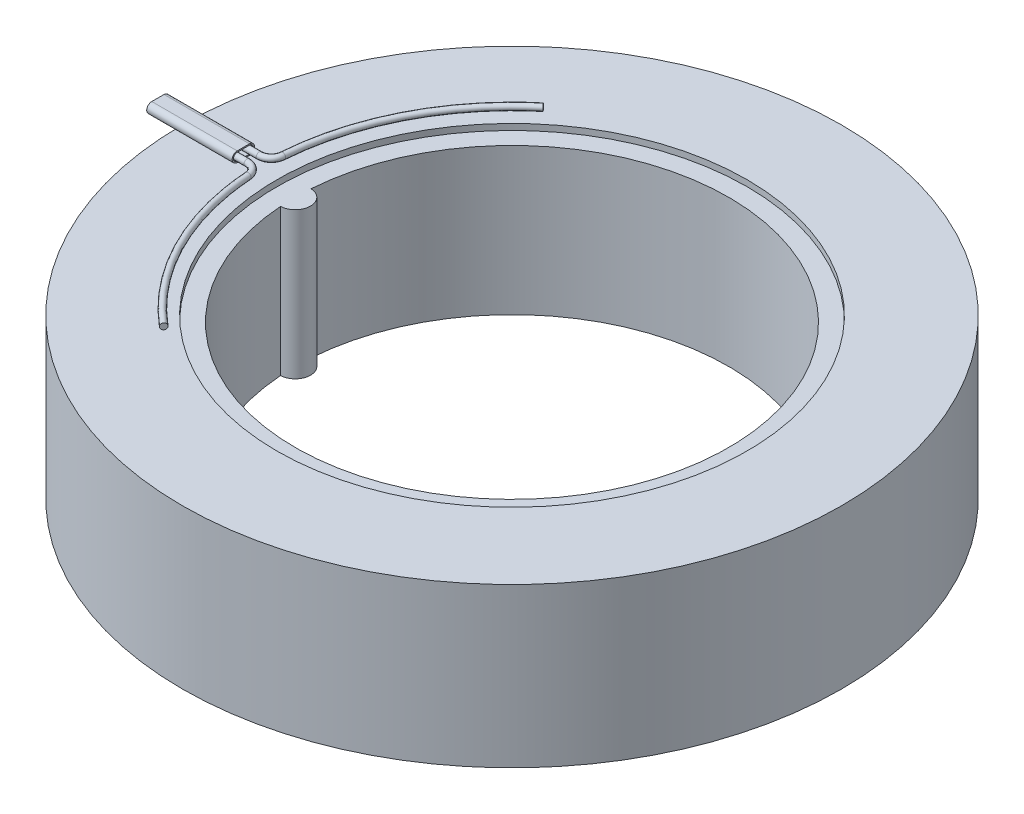
ISO-10303-21;
HEADER;
FILE_DESCRIPTION(('STEP AP214'),'2;1');
FILE_NAME('part.step','',(''),(''),'','','');
FILE_SCHEMA(('AUTOMOTIVE_DESIGN { 1 0 10303 214 1 1 1 1 }'));
ENDSEC;
DATA;
#1=APPLICATION_CONTEXT('core data for automotive mechanical design processes');
#2=APPLICATION_PROTOCOL_DEFINITION('international standard','automotive_design',2000,#1);
#3=PRODUCT_CONTEXT('',#1,'mechanical');
#4=PRODUCT('Part','Part','',(#3));
#5=PRODUCT_RELATED_PRODUCT_CATEGORY('part','',(#4));
#6=PRODUCT_DEFINITION_FORMATION('','',#4);
#7=PRODUCT_DEFINITION_CONTEXT('part definition',#1,'design');
#8=PRODUCT_DEFINITION('design','',#6,#7);
#9=PRODUCT_DEFINITION_SHAPE('','',#8);
#10=(LENGTH_UNIT() NAMED_UNIT(*) SI_UNIT(.MILLI.,.METRE.));
#11=(NAMED_UNIT(*) PLANE_ANGLE_UNIT() SI_UNIT($,.RADIAN.));
#12=(NAMED_UNIT(*) SI_UNIT($,.STERADIAN.) SOLID_ANGLE_UNIT());
#13=UNCERTAINTY_MEASURE_WITH_UNIT(LENGTH_MEASURE(1.E-05),#10,'distance_accuracy_value','');
#14=(GEOMETRIC_REPRESENTATION_CONTEXT(3) GLOBAL_UNCERTAINTY_ASSIGNED_CONTEXT((#13)) GLOBAL_UNIT_ASSIGNED_CONTEXT((#10,
#11,#12)) REPRESENTATION_CONTEXT('',''));
#15=CARTESIAN_POINT('',(0.,0.,0.));
#16=DIRECTION('',(0.,0.,1.));
#17=DIRECTION('',(1.,0.,0.));
#18=AXIS2_PLACEMENT_3D('',#15,#16,#17);
#19=CARTESIAN_POINT('',(-17.75,9.53553390593274,0.));
#20=DIRECTION('',(0.,-1.,0.));
#21=DIRECTION('',(0.,0.,-1.));
#22=AXIS2_PLACEMENT_3D('',#19,#20,#21);
#23=CYLINDRICAL_SURFACE('',#22,1.25);
#24=DIRECTION('',(0.,1.,0.));
#25=VECTOR('',#24,1.);
#26=CARTESIAN_POINT('',(-17.705985915493,0.,-1.24922486381157));
#27=LINE('',#26,#25);
#28=CARTESIAN_POINT('',(-17.705985915493,-6.,-1.24922486381156));
#29=VERTEX_POINT('',#28);
#30=CARTESIAN_POINT('',(-17.705985915493,6.,-1.24922486381156));
#31=VERTEX_POINT('',#30);
#32=EDGE_CURVE('P0_E39',#29,#31,#27,.T.);
#33=ORIENTED_EDGE('',*,*,#32,.T.);
#34=CARTESIAN_POINT('',(-17.75,6.,0.));
#35=DIRECTION('',(0.,-1.,0.));
#36=DIRECTION('',(0.,0.,-1.));
#37=AXIS2_PLACEMENT_3D('',#34,#35,#36);
#38=CIRCLE('',#37,1.25);
#39=CARTESIAN_POINT('',(-17.705985915493,6.,1.24922486381156));
#40=VERTEX_POINT('',#39);
#41=EDGE_CURVE('P0_E51',#40,#31,#38,.F.);
#42=ORIENTED_EDGE('',*,*,#41,.F.);
#43=DIRECTION('',(0.,-1.,0.));
#44=VECTOR('',#43,1.);
#45=CARTESIAN_POINT('',(-17.705985915493,9.53553390593274,1.24922486381156));
#46=LINE('',#45,#44);
#47=CARTESIAN_POINT('',(-17.705985915493,-6.,1.24922486381156));
#48=VERTEX_POINT('',#47);
#49=EDGE_CURVE('P0_E44',#40,#48,#46,.T.);
#50=ORIENTED_EDGE('',*,*,#49,.T.);
#51=CARTESIAN_POINT('',(-17.75,-6.,0.));
#52=DIRECTION('',(0.,-1.,0.));
#53=DIRECTION('',(0.,0.,-1.));
#54=AXIS2_PLACEMENT_3D('',#51,#52,#53);
#55=CIRCLE('',#54,1.25);
#56=EDGE_CURVE('P0_E48',#29,#48,#55,.T.);
#57=ORIENTED_EDGE('',*,*,#56,.F.);
#58=EDGE_LOOP('',(#33,#42,#50,#57));
#59=FACE_BOUND('',#58,.T.);
#60=ADVANCED_FACE('P0_F16',(#59),#23,.T.);
#61=CARTESIAN_POINT('',(0.,0.,0.));
#62=DIRECTION('',(0.,1.,0.));
#63=DIRECTION('',(0.,0.,1.));
#64=AXIS2_PLACEMENT_3D('',#61,#62,#63);
#65=CYLINDRICAL_SURFACE('',#64,17.75);
#66=CARTESIAN_POINT('',(0.,-6.,0.));
#67=DIRECTION('',(0.,1.,0.));
#68=DIRECTION('',(0.,0.,1.));
#69=AXIS2_PLACEMENT_3D('',#66,#67,#68);
#70=CIRCLE('',#69,17.75);
#71=EDGE_CURVE('P0_E19',#48,#29,#70,.T.);
#72=ORIENTED_EDGE('',*,*,#71,.F.);
#73=ORIENTED_EDGE('',*,*,#49,.F.);
#74=CARTESIAN_POINT('',(0.,6.,0.));
#75=DIRECTION('',(0.,1.,0.));
#76=DIRECTION('',(0.,0.,1.));
#77=AXIS2_PLACEMENT_3D('',#74,#75,#76);
#78=CIRCLE('',#77,17.75);
#79=EDGE_CURVE('P0_E34',#31,#40,#78,.F.);
#80=ORIENTED_EDGE('',*,*,#79,.F.);
#81=ORIENTED_EDGE('',*,*,#32,.F.);
#82=EDGE_LOOP('',(#72,#73,#80,#81));
#83=FACE_BOUND('',#82,.T.);
#84=ADVANCED_FACE('P0_F43',(#83),#65,.F.);
#85=CARTESIAN_POINT('',(-19.25,-6.,0.));
#86=DIRECTION('',(0.,-1.,0.));
#87=DIRECTION('',(0.,0.,-1.));
#88=AXIS2_PLACEMENT_3D('',#85,#86,#87);
#89=PLANE('',#88);
#90=CARTESIAN_POINT('',(0.,-6.,0.));
#91=DIRECTION('',(0.,1.,0.));
#92=DIRECTION('',(0.,0.,1.));
#93=AXIS2_PLACEMENT_3D('',#90,#91,#92);
#94=CIRCLE('',#93,19.25);
#95=CARTESIAN_POINT('',(0.,-6.,19.25));
#96=VERTEX_POINT('',#95);
#97=EDGE_CURVE('P0_E25',#96,#96,#94,.T.);
#98=ORIENTED_EDGE('',*,*,#97,.F.);
#99=EDGE_LOOP('',(#98));
#100=FACE_BOUND('',#99,.T.);
#101=ORIENTED_EDGE('',*,*,#71,.T.);
#102=ORIENTED_EDGE('',*,*,#56,.T.);
#103=EDGE_LOOP('',(#101,#102));
#104=FACE_BOUND('',#103,.T.);
#105=ADVANCED_FACE('P0_F53',(#100,#104),#89,.T.);
#106=CARTESIAN_POINT('',(-17.75,6.,0.));
#107=DIRECTION('',(0.,1.,0.));
#108=DIRECTION('',(0.,0.,1.));
#109=AXIS2_PLACEMENT_3D('',#106,#107,#108);
#110=PLANE('',#109);
#111=ORIENTED_EDGE('',*,*,#41,.T.);
#112=ORIENTED_EDGE('',*,*,#79,.T.);
#113=EDGE_LOOP('',(#111,#112));
#114=FACE_BOUND('',#113,.T.);
#115=CARTESIAN_POINT('',(0.,6.,0.));
#116=DIRECTION('',(0.,1.,0.));
#117=DIRECTION('',(0.,0.,1.));
#118=AXIS2_PLACEMENT_3D('',#115,#116,#117);
#119=CIRCLE('',#118,19.25);
#120=CARTESIAN_POINT('',(0.,6.,19.25));
#121=VERTEX_POINT('',#120);
#122=EDGE_CURVE('P0_E11',#121,#121,#119,.F.);
#123=ORIENTED_EDGE('',*,*,#122,.F.);
#124=EDGE_LOOP('',(#123));
#125=FACE_BOUND('',#124,.T.);
#126=ADVANCED_FACE('P0_F60',(#114,#125),#110,.T.);
#127=CARTESIAN_POINT('',(0.,0.,0.));
#128=DIRECTION('',(0.,1.,0.));
#129=DIRECTION('',(0.,0.,1.));
#130=AXIS2_PLACEMENT_3D('',#127,#128,#129);
#131=CYLINDRICAL_SURFACE('',#130,19.25);
#132=ORIENTED_EDGE('',*,*,#122,.T.);
#133=EDGE_LOOP('',(#132));
#134=FACE_BOUND('',#133,.T.);
#135=ORIENTED_EDGE('',*,*,#97,.T.);
#136=EDGE_LOOP('',(#135));
#137=FACE_BOUND('',#136,.T.);
#138=ADVANCED_FACE('P0_F63',(#134,#137),#131,.T.);
#139=CLOSED_SHELL('',(#60,#84,#105,#126,#138));
#140=MANIFOLD_SOLID_BREP('P0_B1',#139);
#141=CARTESIAN_POINT('',(-29.,7.31488072437514,-0.499999999999997));
#142=DIRECTION('',(0.,1.,0.));
#143=DIRECTION('',(0.,0.,1.));
#144=AXIS2_PLACEMENT_3D('',#141,#142,#143);
#145=PLANE('',#144);
#146=DIRECTION('',(1.,0.,0.));
#147=VECTOR('',#146,1.);
#148=CARTESIAN_POINT('',(-29.,7.31488072437514,0.499999999999997));
#149=LINE('',#148,#147);
#150=CARTESIAN_POINT('',(-22.,7.31488072437514,0.499999999999997));
#151=VERTEX_POINT('',#150);
#152=CARTESIAN_POINT('',(-29.,7.31488072437514,0.499999999999997));
#153=VERTEX_POINT('',#152);
#154=EDGE_CURVE('P1_E91',#151,#153,#149,.F.);
#155=ORIENTED_EDGE('',*,*,#154,.T.);
#156=DIRECTION('',(0.,0.,1.));
#157=VECTOR('',#156,1.);
#158=CARTESIAN_POINT('',(-29.,7.31488072437514,-0.499999999999997));
#159=LINE('',#158,#157);
#160=CARTESIAN_POINT('',(-29.,7.31488072437514,-0.499999999999997));
#161=VERTEX_POINT('',#160);
#162=EDGE_CURVE('P1_E78',#161,#153,#159,.T.);
#163=ORIENTED_EDGE('',*,*,#162,.F.);
#164=DIRECTION('',(1.,0.,0.));
#165=VECTOR('',#164,1.);
#166=CARTESIAN_POINT('',(-29.,7.31488072437514,-0.499999999999997));
#167=LINE('',#166,#165);
#168=CARTESIAN_POINT('',(-22.,7.31488072437514,-0.499999999999997));
#169=VERTEX_POINT('',#168);
#170=EDGE_CURVE('P1_E100',#161,#169,#167,.T.);
#171=ORIENTED_EDGE('',*,*,#170,.T.);
#172=DIRECTION('',(0.,0.,1.));
#173=VECTOR('',#172,1.);
#174=CARTESIAN_POINT('',(-22.,7.31488072437514,-0.499999999999997));
#175=LINE('',#174,#173);
#176=EDGE_CURVE('P1_E88',#151,#169,#175,.F.);
#177=ORIENTED_EDGE('',*,*,#176,.F.);
#178=EDGE_LOOP('',(#155,#163,#171,#177));
#179=FACE_BOUND('',#178,.T.);
#180=ADVANCED_FACE('P1_F16',(#179),#145,.F.);
#181=CARTESIAN_POINT('',(-29.,7.,0.499999999999997));
#182=DIRECTION('',(1.,0.,0.));
#183=DIRECTION('',(0.,0.,-1.));
#184=AXIS2_PLACEMENT_3D('',#181,#182,#183);
#185=CYLINDRICAL_SURFACE('',#184,0.31488072437514);
#186=DIRECTION('',(1.,0.,0.));
#187=VECTOR('',#186,1.);
#188=CARTESIAN_POINT('',(-29.,6.68511927562486,0.499999999999997));
#189=LINE('',#188,#187);
#190=CARTESIAN_POINT('',(-22.,6.68511927562486,0.499999999999997));
#191=VERTEX_POINT('',#190);
#192=CARTESIAN_POINT('',(-29.,6.68511927562486,0.499999999999997));
#193=VERTEX_POINT('',#192);
#194=EDGE_CURVE('P1_E97',#191,#193,#189,.F.);
#195=ORIENTED_EDGE('',*,*,#194,.T.);
#196=CARTESIAN_POINT('',(-29.,7.,0.499999999999997));
#197=DIRECTION('',(1.,0.,0.));
#198=DIRECTION('',(0.,0.,-1.));
#199=AXIS2_PLACEMENT_3D('',#196,#197,#198);
#200=CIRCLE('',#199,0.31488072437514);
#201=EDGE_CURVE('P1_E19',#153,#193,#200,.T.);
#202=ORIENTED_EDGE('',*,*,#201,.F.);
#203=ORIENTED_EDGE('',*,*,#154,.F.);
#204=CARTESIAN_POINT('',(-22.,7.,0.499999999999997));
#205=DIRECTION('',(1.,0.,0.));
#206=DIRECTION('',(0.,0.,-1.));
#207=AXIS2_PLACEMENT_3D('',#204,#205,#206);
#208=CIRCLE('',#207,0.31488072437514);
#209=EDGE_CURVE('P1_E99',#191,#151,#208,.F.);
#210=ORIENTED_EDGE('',*,*,#209,.F.);
#211=EDGE_LOOP('',(#195,#202,#203,#210));
#212=FACE_BOUND('',#211,.T.);
#213=ADVANCED_FACE('P1_F95',(#212),#185,.F.);
#214=CARTESIAN_POINT('',(-29.,7.,-0.499999999999997));
#215=DIRECTION('',(1.,0.,0.));
#216=DIRECTION('',(0.,0.,-1.));
#217=AXIS2_PLACEMENT_3D('',#214,#215,#216);
#218=CYLINDRICAL_SURFACE('',#217,0.314880724375139);
#219=CARTESIAN_POINT('',(-29.,7.,-0.499999999999997));
#220=DIRECTION('',(1.,0.,0.));
#221=DIRECTION('',(0.,0.,-1.));
#222=AXIS2_PLACEMENT_3D('',#219,#220,#221);
#223=CIRCLE('',#222,0.314880724375139);
#224=CARTESIAN_POINT('',(-29.,6.68511927562486,-0.499999999999997));
#225=VERTEX_POINT('',#224);
#226=EDGE_CURVE('P1_E84',#225,#161,#223,.T.);
#227=ORIENTED_EDGE('',*,*,#226,.F.);
#228=DIRECTION('',(1.,0.,0.));
#229=VECTOR('',#228,1.);
#230=CARTESIAN_POINT('',(-29.,6.68511927562486,-0.499999999999997));
#231=LINE('',#230,#229);
#232=CARTESIAN_POINT('',(-22.,6.68511927562486,-0.499999999999997));
#233=VERTEX_POINT('',#232);
#234=EDGE_CURVE('P1_E125',#225,#233,#231,.T.);
#235=ORIENTED_EDGE('',*,*,#234,.T.);
#236=CARTESIAN_POINT('',(-22.,7.,-0.499999999999997));
#237=DIRECTION('',(1.,0.,0.));
#238=DIRECTION('',(0.,0.,-1.));
#239=AXIS2_PLACEMENT_3D('',#236,#237,#238);
#240=CIRCLE('',#239,0.314880724375139);
#241=EDGE_CURVE('P1_E106',#169,#233,#240,.F.);
#242=ORIENTED_EDGE('',*,*,#241,.F.);
#243=ORIENTED_EDGE('',*,*,#170,.F.);
#244=EDGE_LOOP('',(#227,#235,#242,#243));
#245=FACE_BOUND('',#244,.T.);
#246=ADVANCED_FACE('P1_F167',(#245),#218,.F.);
#247=CARTESIAN_POINT('',(-29.,6.68511927562486,-0.499999999999997));
#248=DIRECTION('',(0.,-1.,0.));
#249=DIRECTION('',(0.,0.,-1.));
#250=AXIS2_PLACEMENT_3D('',#247,#248,#249);
#251=PLANE('',#250);
#252=ORIENTED_EDGE('',*,*,#234,.F.);
#253=DIRECTION('',(0.,0.,-1.));
#254=VECTOR('',#253,1.);
#255=CARTESIAN_POINT('',(-29.,6.68511927562486,-0.499999999999997));
#256=LINE('',#255,#254);
#257=EDGE_CURVE('P1_E131',#225,#193,#256,.F.);
#258=ORIENTED_EDGE('',*,*,#257,.T.);
#259=ORIENTED_EDGE('',*,*,#194,.F.);
#260=DIRECTION('',(0.,0.,-1.));
#261=VECTOR('',#260,1.);
#262=CARTESIAN_POINT('',(-22.,6.68511927562486,-0.499999999999997));
#263=LINE('',#262,#261);
#264=EDGE_CURVE('P1_E109',#233,#191,#263,.F.);
#265=ORIENTED_EDGE('',*,*,#264,.F.);
#266=EDGE_LOOP('',(#252,#258,#259,#265));
#267=FACE_BOUND('',#266,.T.);
#268=ADVANCED_FACE('P1_F159',(#267),#251,.F.);
#269=CARTESIAN_POINT('',(-29.,7.,-0.499999999999997));
#270=DIRECTION('',(1.,0.,0.));
#271=DIRECTION('',(0.,0.,-1.));
#272=AXIS2_PLACEMENT_3D('',#269,#270,#271);
#273=CYLINDRICAL_SURFACE('',#272,0.414880724375139);
#274=CARTESIAN_POINT('',(-22.,7.,-0.499999999999997));
#275=DIRECTION('',(1.,0.,0.));
#276=DIRECTION('',(0.,0.,-1.));
#277=AXIS2_PLACEMENT_3D('',#274,#275,#276);
#278=CIRCLE('',#277,0.414880724375139);
#279=CARTESIAN_POINT('',(-22.,6.58511927562486,-0.499999999999997));
#280=VERTEX_POINT('',#279);
#281=CARTESIAN_POINT('',(-22.,7.41488072437514,-0.499999999999997));
#282=VERTEX_POINT('',#281);
#283=EDGE_CURVE('P1_E108',#280,#282,#278,.T.);
#284=ORIENTED_EDGE('',*,*,#283,.F.);
#285=DIRECTION('',(1.,0.,0.));
#286=VECTOR('',#285,1.);
#287=CARTESIAN_POINT('',(-29.,6.58511927562486,-0.499999999999997));
#288=LINE('',#287,#286);
#289=CARTESIAN_POINT('',(-29.,6.58511927562486,-0.499999999999997));
#290=VERTEX_POINT('',#289);
#291=EDGE_CURVE('P1_E120',#290,#280,#288,.T.);
#292=ORIENTED_EDGE('',*,*,#291,.F.);
#293=CARTESIAN_POINT('',(-29.,7.,-0.499999999999997));
#294=DIRECTION('',(1.,0.,0.));
#295=DIRECTION('',(0.,0.,-1.));
#296=AXIS2_PLACEMENT_3D('',#293,#294,#295);
#297=CIRCLE('',#296,0.414880724375139);
#298=CARTESIAN_POINT('',(-29.,7.41488072437514,-0.499999999999997));
#299=VERTEX_POINT('',#298);
#300=EDGE_CURVE('P1_E112',#290,#299,#297,.T.);
#301=ORIENTED_EDGE('',*,*,#300,.T.);
#302=DIRECTION('',(1.,0.,0.));
#303=VECTOR('',#302,1.);
#304=CARTESIAN_POINT('',(-29.,7.41488072437514,-0.499999999999997));
#305=LINE('',#304,#303);
#306=EDGE_CURVE('P1_E128',#282,#299,#305,.F.);
#307=ORIENTED_EDGE('',*,*,#306,.F.);
#308=EDGE_LOOP('',(#284,#292,#301,#307));
#309=FACE_BOUND('',#308,.T.);
#310=ADVANCED_FACE('P1_F157',(#309),#273,.T.);
#311=CARTESIAN_POINT('',(-22.,7.,-0.499999999999997));
#312=DIRECTION('',(1.,0.,0.));
#313=DIRECTION('',(0.,0.,-1.));
#314=AXIS2_PLACEMENT_3D('',#311,#312,#313);
#315=PLANE('',#314);
#316=CARTESIAN_POINT('',(-22.,7.,0.499999999999997));
#317=DIRECTION('',(1.,0.,0.));
#318=DIRECTION('',(0.,0.,-1.));
#319=AXIS2_PLACEMENT_3D('',#316,#317,#318);
#320=CIRCLE('',#319,0.41488072437514);
#321=CARTESIAN_POINT('',(-22.,6.58511927562486,0.499999999999997));
#322=VERTEX_POINT('',#321);
#323=CARTESIAN_POINT('',(-22.,7.41488072437514,0.499999999999997));
#324=VERTEX_POINT('',#323);
#325=EDGE_CURVE('P1_E116',#322,#324,#320,.F.);
#326=ORIENTED_EDGE('',*,*,#325,.F.);
#327=DIRECTION('',(0.,0.,-1.));
#328=VECTOR('',#327,1.);
#329=CARTESIAN_POINT('',(-22.,6.58511927562486,-0.499999999999997));
#330=LINE('',#329,#328);
#331=EDGE_CURVE('P1_E114',#280,#322,#330,.F.);
#332=ORIENTED_EDGE('',*,*,#331,.F.);
#333=ORIENTED_EDGE('',*,*,#283,.T.);
#334=DIRECTION('',(0.,0.,1.));
#335=VECTOR('',#334,1.);
#336=CARTESIAN_POINT('',(-22.,7.41488072437514,-0.499999999999997));
#337=LINE('',#336,#335);
#338=EDGE_CURVE('P1_E111',#324,#282,#337,.F.);
#339=ORIENTED_EDGE('',*,*,#338,.F.);
#340=EDGE_LOOP('',(#326,#332,#333,#339));
#341=FACE_BOUND('',#340,.T.);
#342=ORIENTED_EDGE('',*,*,#176,.T.);
#343=ORIENTED_EDGE('',*,*,#241,.T.);
#344=ORIENTED_EDGE('',*,*,#264,.T.);
#345=ORIENTED_EDGE('',*,*,#209,.T.);
#346=EDGE_LOOP('',(#342,#343,#344,#345));
#347=FACE_BOUND('',#346,.T.);
#348=ADVANCED_FACE('P1_F152',(#341,#347),#315,.T.);
#349=CARTESIAN_POINT('',(-29.,7.41488072437514,-0.499999999999997));
#350=DIRECTION('',(0.,1.,0.));
#351=DIRECTION('',(0.,0.,1.));
#352=AXIS2_PLACEMENT_3D('',#349,#350,#351);
#353=PLANE('',#352);
#354=DIRECTION('',(0.,0.,-1.));
#355=VECTOR('',#354,1.);
#356=CARTESIAN_POINT('',(-29.,7.41488072437514,-0.499999999999997));
#357=LINE('',#356,#355);
#358=CARTESIAN_POINT('',(-29.,7.41488072437514,0.499999999999997));
#359=VERTEX_POINT('',#358);
#360=EDGE_CURVE('P1_E115',#299,#359,#357,.F.);
#361=ORIENTED_EDGE('',*,*,#360,.T.);
#362=DIRECTION('',(1.,0.,0.));
#363=VECTOR('',#362,1.);
#364=CARTESIAN_POINT('',(-29.,7.41488072437514,0.499999999999997));
#365=LINE('',#364,#363);
#366=EDGE_CURVE('P1_E119',#324,#359,#365,.F.);
#367=ORIENTED_EDGE('',*,*,#366,.F.);
#368=ORIENTED_EDGE('',*,*,#338,.T.);
#369=ORIENTED_EDGE('',*,*,#306,.T.);
#370=EDGE_LOOP('',(#361,#367,#368,#369));
#371=FACE_BOUND('',#370,.T.);
#372=ADVANCED_FACE('P1_F146',(#371),#353,.T.);
#373=CARTESIAN_POINT('',(-29.,7.,-0.499999999999997));
#374=DIRECTION('',(1.,0.,0.));
#375=DIRECTION('',(0.,0.,-1.));
#376=AXIS2_PLACEMENT_3D('',#373,#374,#375);
#377=PLANE('',#376);
#378=DIRECTION('',(0.,0.,-1.));
#379=VECTOR('',#378,1.);
#380=CARTESIAN_POINT('',(-29.,6.58511927562486,-0.499999999999997));
#381=LINE('',#380,#379);
#382=CARTESIAN_POINT('',(-29.,6.58511927562486,0.499999999999997));
#383=VERTEX_POINT('',#382);
#384=EDGE_CURVE('P1_E34',#383,#290,#381,.T.);
#385=ORIENTED_EDGE('',*,*,#384,.F.);
#386=CARTESIAN_POINT('',(-29.,7.,0.499999999999997));
#387=DIRECTION('',(1.,0.,0.));
#388=DIRECTION('',(0.,0.,-1.));
#389=AXIS2_PLACEMENT_3D('',#386,#387,#388);
#390=CIRCLE('',#389,0.41488072437514);
#391=EDGE_CURVE('P1_E25',#359,#383,#390,.T.);
#392=ORIENTED_EDGE('',*,*,#391,.F.);
#393=ORIENTED_EDGE('',*,*,#360,.F.);
#394=ORIENTED_EDGE('',*,*,#300,.F.);
#395=EDGE_LOOP('',(#385,#392,#393,#394));
#396=FACE_BOUND('',#395,.T.);
#397=ORIENTED_EDGE('',*,*,#257,.F.);
#398=ORIENTED_EDGE('',*,*,#226,.T.);
#399=ORIENTED_EDGE('',*,*,#162,.T.);
#400=ORIENTED_EDGE('',*,*,#201,.T.);
#401=EDGE_LOOP('',(#397,#398,#399,#400));
#402=FACE_BOUND('',#401,.T.);
#403=ADVANCED_FACE('P1_F81',(#396,#402),#377,.F.);
#404=CARTESIAN_POINT('',(-29.,6.58511927562486,-0.499999999999997));
#405=DIRECTION('',(0.,-1.,0.));
#406=DIRECTION('',(0.,0.,-1.));
#407=AXIS2_PLACEMENT_3D('',#404,#405,#406);
#408=PLANE('',#407);
#409=ORIENTED_EDGE('',*,*,#384,.T.);
#410=ORIENTED_EDGE('',*,*,#291,.T.);
#411=ORIENTED_EDGE('',*,*,#331,.T.);
#412=DIRECTION('',(1.,0.,0.));
#413=VECTOR('',#412,1.);
#414=CARTESIAN_POINT('',(-29.,6.58511927562486,0.499999999999997));
#415=LINE('',#414,#413);
#416=EDGE_CURVE('P1_E11',#383,#322,#415,.T.);
#417=ORIENTED_EDGE('',*,*,#416,.F.);
#418=EDGE_LOOP('',(#409,#410,#411,#417));
#419=FACE_BOUND('',#418,.T.);
#420=ADVANCED_FACE('P1_F154',(#419),#408,.T.);
#421=CARTESIAN_POINT('',(-29.,7.,0.499999999999997));
#422=DIRECTION('',(1.,0.,0.));
#423=DIRECTION('',(0.,0.,-1.));
#424=AXIS2_PLACEMENT_3D('',#421,#422,#423);
#425=CYLINDRICAL_SURFACE('',#424,0.41488072437514);
#426=ORIENTED_EDGE('',*,*,#391,.T.);
#427=ORIENTED_EDGE('',*,*,#416,.T.);
#428=ORIENTED_EDGE('',*,*,#325,.T.);
#429=ORIENTED_EDGE('',*,*,#366,.T.);
#430=EDGE_LOOP('',(#426,#427,#428,#429));
#431=FACE_BOUND('',#430,.T.);
#432=ADVANCED_FACE('P1_F149',(#431),#425,.T.);
#433=CLOSED_SHELL('',(#180,#213,#246,#268,#310,#348,#372,#403,#420,#432));
#434=MANIFOLD_SOLID_BREP('P1_B1',#433);
#435=CARTESIAN_POINT('',(-25.807382336069,7.,0.499999999999997));
#436=DIRECTION('',(-1.,0.,0.));
#437=DIRECTION('',(0.,0.,1.));
#438=AXIS2_PLACEMENT_3D('',#435,#436,#437);
#439=PLANE('',#438);
#440=CARTESIAN_POINT('',(-25.807382336069,7.,0.499999999999997));
#441=DIRECTION('',(1.,0.,0.));
#442=DIRECTION('',(0.,0.,-1.));
#443=AXIS2_PLACEMENT_3D('',#440,#441,#442);
#444=CIRCLE('',#443,0.25);
#445=CARTESIAN_POINT('',(-25.807382336069,7.,0.249999999999997));
#446=VERTEX_POINT('',#445);
#447=EDGE_CURVE('P2_E17',#446,#446,#444,.T.);
#448=ORIENTED_EDGE('',*,*,#447,.F.);
#449=EDGE_LOOP('',(#448));
#450=FACE_BOUND('',#449,.T.);
#451=ADVANCED_FACE('P2_F14',(#450),#439,.T.);
#452=CARTESIAN_POINT('',(-25.807382336069,7.,0.499999999999997));
#453=DIRECTION('',(1.,0.,0.));
#454=DIRECTION('',(0.,0.,-1.));
#455=AXIS2_PLACEMENT_3D('',#452,#453,#454);
#456=CYLINDRICAL_SURFACE('',#455,0.25);
#457=ORIENTED_EDGE('',*,*,#447,.T.);
#458=EDGE_LOOP('',(#457));
#459=FACE_BOUND('',#458,.T.);
#460=CARTESIAN_POINT('',(-21.1969927112315,7.,0.499999999999997));
#461=DIRECTION('',(-1.,0.,0.));
#462=DIRECTION('',(0.,0.,-1.));
#463=AXIS2_PLACEMENT_3D('',#460,#461,#462);
#464=CIRCLE('',#463,0.25);
#465=CARTESIAN_POINT('',(-21.1969927112315,7.,0.249999999999997));
#466=VERTEX_POINT('',#465);
#467=EDGE_CURVE('P2_E25',#466,#466,#464,.F.);
#468=ORIENTED_EDGE('',*,*,#467,.F.);
#469=EDGE_LOOP('',(#468));
#470=FACE_BOUND('',#469,.T.);
#471=ADVANCED_FACE('P2_F44',(#459,#470),#456,.T.);
#472=CARTESIAN_POINT('',(-21.1969927112315,7.,1.5));
#473=DIRECTION('',(0.,1.,0.));
#474=DIRECTION('',(0.,0.,-1.));
#475=AXIS2_PLACEMENT_3D('',#472,#473,#474);
#476=TOROIDAL_SURFACE('',#475,1.,0.25);
#477=CARTESIAN_POINT('',(-20.1994871718794,7.,1.42941176470588));
#478=DIRECTION('',(-0.0705882352941176,0.,-0.997505539352069));
#479=DIRECTION('',(-0.997505539352069,0.,0.0705882352941176));
#480=AXIS2_PLACEMENT_3D('',#477,#478,#479);
#481=CIRCLE('',#480,0.25);
#482=CARTESIAN_POINT('',(-20.4488635567174,7.,1.44705882352941));
#483=VERTEX_POINT('',#482);
#484=EDGE_CURVE('P2_E21',#483,#483,#481,.F.);
#485=ORIENTED_EDGE('',*,*,#484,.F.);
#486=EDGE_LOOP('',(#485));
#487=FACE_BOUND('',#486,.T.);
#488=ORIENTED_EDGE('',*,*,#467,.T.);
#489=EDGE_LOOP('',(#488));
#490=FACE_BOUND('',#489,.T.);
#491=ADVANCED_FACE('P2_F42',(#487,#490),#476,.T.);
#492=CARTESIAN_POINT('',(-12.9841026207754,7.,15.5394845195448));
#493=DIRECTION('',(-0.767381951582462,0.,-0.641190252877796));
#494=DIRECTION('',(-0.641190252877796,0.,0.767381951582462));
#495=AXIS2_PLACEMENT_3D('',#492,#493,#494);
#496=PLANE('',#495);
#497=CARTESIAN_POINT('',(-13.1444001839948,7.,15.7313300074404));
#498=CARTESIAN_POINT('',(-13.1443994443546,7.01403452597362,15.7313291222327));
#499=CARTESIAN_POINT('',(-13.1436396331271,7.02808178578031,15.7304197736892));
#500=CARTESIAN_POINT('',(-13.1406168573724,7.05580153206776,15.7268020899401));
#501=CARTESIAN_POINT('',(-13.1383506757582,7.06947315109552,15.7240899044976));
#502=CARTESIAN_POINT('',(-13.1323826736851,7.09600601144092,15.716947348825));
#503=CARTESIAN_POINT('',(-13.1286834155892,7.10886865177959,15.7125200452528));
#504=CARTESIAN_POINT('',(-13.1199474074266,7.13346083586166,15.7020647163349));
#505=CARTESIAN_POINT('',(-13.1149087599779,7.14518873973317,15.6960344201861));
#506=CARTESIAN_POINT('',(-13.1036477344887,7.16714217772219,15.6825571290422));
#507=CARTESIAN_POINT('',(-13.0974270355999,7.17736980695587,15.67511214367));
#508=CARTESIAN_POINT('',(-13.0839641119303,7.19606555442686,15.658999602044));
#509=CARTESIAN_POINT('',(-13.0767204693046,7.20453118947873,15.6503303489016));
#510=CARTESIAN_POINT('',(-13.0614347790551,7.21943391044075,15.63203630472));
#511=CARTESIAN_POINT('',(-13.0533938403538,7.22587376327952,15.6224128408488));
#512=CARTESIAN_POINT('',(-13.0367218770331,7.23656542879974,15.6024596932576));
#513=CARTESIAN_POINT('',(-13.0280900718166,7.24081428118327,15.5921290753122));
#514=CARTESIAN_POINT('',(-13.0104974211687,7.2469878907622,15.5710740412922));
#515=CARTESIAN_POINT('',(-13.0015368010541,7.24891420989792,15.5603498948784));
#516=CARTESIAN_POINT('',(-12.9835353815354,7.25039332216517,15.5388056427948));
#517=CARTESIAN_POINT('',(-12.9744945821313,7.2499461152967,15.527985537125));
#518=CARTESIAN_POINT('',(-12.9565833799862,7.24668973033698,15.5065492579621));
#519=CARTESIAN_POINT('',(-12.94771309608,7.2438789620277,15.4959332266914));
#520=CARTESIAN_POINT('',(-12.9304130834503,7.23597865228467,15.4752284243419));
#521=CARTESIAN_POINT('',(-12.9219827778988,7.23089218268358,15.4651389629106));
#522=CARTESIAN_POINT('',(-12.9057776470403,7.21857694987816,15.4457445243832));
#523=CARTESIAN_POINT('',(-12.8980037380968,7.21134525333469,15.4364406439986));
#524=CARTESIAN_POINT('',(-12.8833557305479,7.19495928055486,15.4189097839003));
#525=CARTESIAN_POINT('',(-12.8764803892498,7.18580770611078,15.4106813169211));
#526=CARTESIAN_POINT('',(-12.8638026056751,7.16582123445506,15.3955084376428));
#527=CARTESIAN_POINT('',(-12.8580016920975,7.15498397854958,15.3885658549038));
#528=CARTESIAN_POINT('',(-12.8476571638487,7.13195957391014,15.3761854354571));
#529=CARTESIAN_POINT('',(-12.8431117727845,7.11977436690904,15.3707454727472));
#530=CARTESIAN_POINT('',(-12.8353891754454,7.09436641415784,15.3615030025276));
#531=CARTESIAN_POINT('',(-12.8322144230905,7.08114185721668,15.3577034318901));
#532=CARTESIAN_POINT('',(-12.8273407819298,7.05407093126813,15.3518706166712));
#533=CARTESIAN_POINT('',(-12.8256387522907,7.04022595212131,15.3498336131136));
#534=CARTESIAN_POINT('',(-12.8241008283407,7.01754360134218,15.3479930126416));
#535=CARTESIAN_POINT('',(-12.8238045951379,7.00877428928519,15.3476384782234));
#536=CARTESIAN_POINT('',(-12.8238057971962,6.98596547402639,15.3476399168569));
#537=CARTESIAN_POINT('',(-12.8245656084236,6.97191821421969,15.3485492654004));
#538=CARTESIAN_POINT('',(-12.8275883841784,6.94419846793224,15.3521669491495));
#539=CARTESIAN_POINT('',(-12.8298545657926,6.93052684890448,15.354879134592));
#540=CARTESIAN_POINT('',(-12.8358225678657,6.90399398855908,15.3620216902646));
#541=CARTESIAN_POINT('',(-12.8395218259616,6.89113134822041,15.3664489938368));
#542=CARTESIAN_POINT('',(-12.8482578341241,6.86653916413834,15.3769043227548));
#543=CARTESIAN_POINT('',(-12.8532964815729,6.85481126026683,15.3829346189035));
#544=CARTESIAN_POINT('',(-12.8645575070621,6.83285782227781,15.3964119100475));
#545=CARTESIAN_POINT('',(-12.8707782059508,6.82263019304413,15.4038568954197));
#546=CARTESIAN_POINT('',(-12.8842411296205,6.80393444557314,15.4199694370456));
#547=CARTESIAN_POINT('',(-12.8914847722462,6.79546881052127,15.4286386901881));
#548=CARTESIAN_POINT('',(-12.9067704624956,6.78056608955925,15.4469327343696));
#549=CARTESIAN_POINT('',(-12.914811401197,6.77412623672048,15.4565561982409));
#550=CARTESIAN_POINT('',(-12.9314833645176,6.76343457120026,15.4765093458321));
#551=CARTESIAN_POINT('',(-12.9401151697342,6.75918571881673,15.4868399637774));
#552=CARTESIAN_POINT('',(-12.957707820382,6.7530121092378,15.5078949977975));
#553=CARTESIAN_POINT('',(-12.9666684404967,6.75108579010208,15.5186191442112));
#554=CARTESIAN_POINT('',(-12.9846698600154,6.74960667783483,15.5401633962948));
#555=CARTESIAN_POINT('',(-12.9937106594195,6.7500538847033,15.5509835019647));
#556=CARTESIAN_POINT('',(-13.0116218615645,6.75331026966302,15.5724197811276));
#557=CARTESIAN_POINT('',(-13.0204921454707,6.75612103797229,15.5830358123983));
#558=CARTESIAN_POINT('',(-13.0377921581005,6.76402134771533,15.6037406147478));
#559=CARTESIAN_POINT('',(-13.0462224636519,6.76910781731642,15.613830076179));
#560=CARTESIAN_POINT('',(-13.0624275945105,6.78142305012184,15.6332245147065));
#561=CARTESIAN_POINT('',(-13.070201503454,6.78865474666531,15.642528395091));
#562=CARTESIAN_POINT('',(-13.0848495110028,6.80504071944515,15.6600592551894));
#563=CARTESIAN_POINT('',(-13.091724852301,6.81419229388922,15.6682877221685));
#564=CARTESIAN_POINT('',(-13.1044026358757,6.83417876554494,15.6834606014468));
#565=CARTESIAN_POINT('',(-13.1102035494532,6.84501602145042,15.6904031841859));
#566=CARTESIAN_POINT('',(-13.120548077702,6.86804042608986,15.7027836036326));
#567=CARTESIAN_POINT('',(-13.1250934687663,6.88022563309096,15.7082235663425));
#568=CARTESIAN_POINT('',(-13.1328160661054,6.90563358584216,15.7174660365621));
#569=CARTESIAN_POINT('',(-13.1359908184602,6.91885814278332,15.7212656071996));
#570=CARTESIAN_POINT('',(-13.1408644596209,6.94592906873187,15.7270984224185));
#571=CARTESIAN_POINT('',(-13.1425664892601,6.95977404787868,15.729135425976));
#572=CARTESIAN_POINT('',(-13.1441044132101,6.98245639865782,15.730976026448));
#573=CARTESIAN_POINT('',(-13.1444006464128,6.99122571071481,15.7313305608662));
#574=CARTESIAN_POINT('',(-13.1444001839948,7.,15.7313300074404));
#575=B_SPLINE_CURVE_WITH_KNOTS('',3,(#497,#498,#499,#500,#501,#502,#503,#504,#505,#506,#507,
#508,#509,#510,#511,#512,#513,#514,#515,#516,#517,#518,#519,#520,#521,#522,#523,#524,#525,#526,
#527,#528,#529,#530,#531,#532,#533,#534,#535,#536,#537,#538,#539,#540,#541,#542,#543,#544,#545,
#546,#547,#548,#549,#550,#551,#552,#553,#554,#555,#556,#557,#558,#559,#560,#561,#562,#563,#564,
#565,#566,#567,#568,#569,#570,#571,#572,#573,#574),.UNSPECIFIED.,.T.,.F.,(4,2,2,2,2,2,2,2,2,2,2,
2,2,2,2,2,2,2,2,2,2,2,2,2,2,2,2,2,2,2,2,2,2,2,2,2,2,2,4),(0.,0.0420760744337983,
0.0842422987846631,0.126333474681813,0.16848459776164,0.210576285145431,0.25272689674592,
0.294819684122835,0.336969195740987,0.379090345306773,0.421211494872558,0.463361006490713,
0.50545379386763,0.547604405468115,0.589696092851908,0.631847215932806,0.673938391831026,
0.716104616182966,0.758180690617831,0.784486363482121,0.826562437915919,0.868728662266785,
0.910819838163934,0.952970961243764,0.995062648627557,1.03721326022804,1.07930604760496,
1.12145555922311,1.1635767087889,1.20569785835468,1.24784736997284,1.28994015734975,
1.33209076895024,1.37418245633404,1.41633357941493,1.45842475531315,1.50059097966509,
1.54266705409995,1.56897272696425),.UNSPECIFIED.);
#576=CARTESIAN_POINT('',(-13.1444001839948,7.,15.7313300074404));
#577=VERTEX_POINT('',#576);
#578=EDGE_CURVE('P2_E10',#577,#577,#575,.T.);
#579=ORIENTED_EDGE('',*,*,#578,.F.);
#580=EDGE_LOOP('',(#579));
#581=FACE_BOUND('',#580,.T.);
#582=ADVANCED_FACE('P2_F33',(#581),#496,.F.);
#583=CARTESIAN_POINT('',(0.,7.,0.));
#584=DIRECTION('',(0.,-1.,0.));
#585=DIRECTION('',(0.,0.,1.));
#586=AXIS2_PLACEMENT_3D('',#583,#584,#585);
#587=TOROIDAL_SURFACE('',#586,20.25,0.25);
#588=ORIENTED_EDGE('',*,*,#578,.T.);
#589=EDGE_LOOP('',(#588));
#590=FACE_BOUND('',#589,.T.);
#591=ORIENTED_EDGE('',*,*,#484,.T.);
#592=EDGE_LOOP('',(#591));
#593=FACE_BOUND('',#592,.T.);
#594=ADVANCED_FACE('P2_F36',(#590,#593),#587,.T.);
#595=CLOSED_SHELL('',(#451,#471,#491,#582,#594));
#596=MANIFOLD_SOLID_BREP('P2_B1',#595);
#597=CARTESIAN_POINT('',(-25.807382336069,7.,-0.499999999999997));
#598=DIRECTION('',(-1.,0.,0.));
#599=DIRECTION('',(0.,0.,1.));
#600=AXIS2_PLACEMENT_3D('',#597,#598,#599);
#601=PLANE('',#600);
#602=CARTESIAN_POINT('',(-25.807382336069,7.,-0.499999999999997));
#603=DIRECTION('',(1.,0.,0.));
#604=DIRECTION('',(0.,0.,-1.));
#605=AXIS2_PLACEMENT_3D('',#602,#603,#604);
#606=CIRCLE('',#605,0.25);
#607=CARTESIAN_POINT('',(-25.807382336069,7.,-0.749999999999997));
#608=VERTEX_POINT('',#607);
#609=EDGE_CURVE('P3_E17',#608,#608,#606,.T.);
#610=ORIENTED_EDGE('',*,*,#609,.F.);
#611=EDGE_LOOP('',(#610));
#612=FACE_BOUND('',#611,.T.);
#613=ADVANCED_FACE('P3_F14',(#612),#601,.T.);
#614=CARTESIAN_POINT('',(-25.807382336069,7.,-0.499999999999997));
#615=DIRECTION('',(1.,0.,0.));
#616=DIRECTION('',(0.,0.,-1.));
#617=AXIS2_PLACEMENT_3D('',#614,#615,#616);
#618=CYLINDRICAL_SURFACE('',#617,0.25);
#619=CARTESIAN_POINT('',(-21.1969927112315,7.,-0.499999999999997));
#620=DIRECTION('',(1.,0.,0.));
#621=DIRECTION('',(0.,0.,1.));
#622=AXIS2_PLACEMENT_3D('',#619,#620,#621);
#623=CIRCLE('',#622,0.25);
#624=CARTESIAN_POINT('',(-21.1969927112315,7.,-0.249999999999997));
#625=VERTEX_POINT('',#624);
#626=EDGE_CURVE('P3_E25',#625,#625,#623,.T.);
#627=ORIENTED_EDGE('',*,*,#626,.F.);
#628=EDGE_LOOP('',(#627));
#629=FACE_BOUND('',#628,.T.);
#630=ORIENTED_EDGE('',*,*,#609,.T.);
#631=EDGE_LOOP('',(#630));
#632=FACE_BOUND('',#631,.T.);
#633=ADVANCED_FACE('P3_F45',(#629,#632),#618,.T.);
#634=CARTESIAN_POINT('',(-21.1969927112315,7.,-1.5));
#635=DIRECTION('',(0.,1.,0.));
#636=DIRECTION('',(0.,0.,1.));
#637=AXIS2_PLACEMENT_3D('',#634,#635,#636);
#638=TOROIDAL_SURFACE('',#637,1.,0.25);
#639=ORIENTED_EDGE('',*,*,#626,.T.);
#640=EDGE_LOOP('',(#639));
#641=FACE_BOUND('',#640,.T.);
#642=CARTESIAN_POINT('',(-20.1994871718794,7.,-1.42941176470587));
#643=DIRECTION('',(0.0705882352941171,0.,-0.997505539352069));
#644=DIRECTION('',(-0.997505539352069,0.,-0.0705882352941171));
#645=AXIS2_PLACEMENT_3D('',#642,#643,#644);
#646=CIRCLE('',#645,0.25);
#647=CARTESIAN_POINT('',(-20.4488635567174,7.,-1.4470588235294));
#648=VERTEX_POINT('',#647);
#649=EDGE_CURVE('P3_E21',#648,#648,#646,.T.);
#650=ORIENTED_EDGE('',*,*,#649,.F.);
#651=EDGE_LOOP('',(#650));
#652=FACE_BOUND('',#651,.T.);
#653=ADVANCED_FACE('P3_F43',(#641,#652),#638,.T.);
#654=CARTESIAN_POINT('',(-12.9841026207754,7.,-15.5394845195448));
#655=DIRECTION('',(-0.767381951582462,0.,0.641190252877796));
#656=DIRECTION('',(0.641190252877796,0.,0.767381951582462));
#657=AXIS2_PLACEMENT_3D('',#654,#655,#656);
#658=PLANE('',#657);
#659=CARTESIAN_POINT('',(-12.8238050575559,7.,-15.3476390316492));
#660=CARTESIAN_POINT('',(-12.8238057971962,7.01403452597362,-15.3476399168569));
#661=CARTESIAN_POINT('',(-12.8245656084236,7.02808178578031,-15.3485492654004));
#662=CARTESIAN_POINT('',(-12.8275883841784,7.05580153206776,-15.3521669491495));
#663=CARTESIAN_POINT('',(-12.8298545657926,7.06947315109552,-15.354879134592));
#664=CARTESIAN_POINT('',(-12.8358225678657,7.09600601144092,-15.3620216902646));
#665=CARTESIAN_POINT('',(-12.8395218259616,7.10886865177959,-15.3664489938368));
#666=CARTESIAN_POINT('',(-12.8482578341241,7.13346083586166,-15.3769043227548));
#667=CARTESIAN_POINT('',(-12.8532964815729,7.14518873973317,-15.3829346189035));
#668=CARTESIAN_POINT('',(-12.8645575070621,7.16714217772219,-15.3964119100475));
#669=CARTESIAN_POINT('',(-12.8707782059508,7.17736980695588,-15.4038568954197));
#670=CARTESIAN_POINT('',(-12.8842411296205,7.19606555442686,-15.4199694370456));
#671=CARTESIAN_POINT('',(-12.8914847722462,7.20453118947873,-15.4286386901881));
#672=CARTESIAN_POINT('',(-12.9067704624956,7.21943391044075,-15.4469327343696));
#673=CARTESIAN_POINT('',(-12.914811401197,7.22587376327953,-15.4565561982409));
#674=CARTESIAN_POINT('',(-12.9314833645176,7.23656542879974,-15.4765093458321));
#675=CARTESIAN_POINT('',(-12.9401151697342,7.24081428118327,-15.4868399637774));
#676=CARTESIAN_POINT('',(-12.957707820382,7.2469878907622,-15.5078949977975));
#677=CARTESIAN_POINT('',(-12.9666684404967,7.24891420989792,-15.5186191442112));
#678=CARTESIAN_POINT('',(-12.9846698600154,7.25039332216517,-15.5401633962948));
#679=CARTESIAN_POINT('',(-12.9937106594195,7.2499461152967,-15.5509835019647));
#680=CARTESIAN_POINT('',(-13.0116218615645,7.24668973033698,-15.5724197811276));
#681=CARTESIAN_POINT('',(-13.0204921454707,7.2438789620277,-15.5830358123983));
#682=CARTESIAN_POINT('',(-13.0377921581005,7.23597865228467,-15.6037406147478));
#683=CARTESIAN_POINT('',(-13.0462224636519,7.23089218268358,-15.613830076179));
#684=CARTESIAN_POINT('',(-13.0624275945105,7.21857694987816,-15.6332245147065));
#685=CARTESIAN_POINT('',(-13.070201503454,7.21134525333469,-15.642528395091));
#686=CARTESIAN_POINT('',(-13.0848495110028,7.19495928055486,-15.6600592551894));
#687=CARTESIAN_POINT('',(-13.091724852301,7.18580770611078,-15.6682877221685));
#688=CARTESIAN_POINT('',(-13.1044026358757,7.16582123445506,-15.6834606014468));
#689=CARTESIAN_POINT('',(-13.1102035494532,7.15498397854958,-15.6904031841859));
#690=CARTESIAN_POINT('',(-13.120548077702,7.13195957391014,-15.7027836036326));
#691=CARTESIAN_POINT('',(-13.1250934687663,7.11977436690904,-15.7082235663425));
#692=CARTESIAN_POINT('',(-13.1328160661054,7.09436641415784,-15.7174660365621));
#693=CARTESIAN_POINT('',(-13.1359908184602,7.08114185721668,-15.7212656071996));
#694=CARTESIAN_POINT('',(-13.1408644596209,7.05407093126813,-15.7270984224185));
#695=CARTESIAN_POINT('',(-13.1425664892601,7.04022595212131,-15.729135425976));
#696=CARTESIAN_POINT('',(-13.1441044132101,7.01754360134218,-15.730976026448));
#697=CARTESIAN_POINT('',(-13.1444006464128,7.00877428928519,-15.7313305608662));
#698=CARTESIAN_POINT('',(-13.1443994443546,6.98596547402639,-15.7313291222327));
#699=CARTESIAN_POINT('',(-13.1436396331271,6.9719182142197,-15.7304197736892));
#700=CARTESIAN_POINT('',(-13.1406168573724,6.94419846793224,-15.7268020899401));
#701=CARTESIAN_POINT('',(-13.1383506757582,6.93052684890448,-15.7240899044976));
#702=CARTESIAN_POINT('',(-13.1323826736851,6.90399398855908,-15.716947348825));
#703=CARTESIAN_POINT('',(-13.1286834155892,6.89113134822041,-15.7125200452528));
#704=CARTESIAN_POINT('',(-13.1199474074266,6.86653916413834,-15.7020647163349));
#705=CARTESIAN_POINT('',(-13.1149087599779,6.85481126026683,-15.6960344201861));
#706=CARTESIAN_POINT('',(-13.1036477344887,6.83285782227781,-15.6825571290422));
#707=CARTESIAN_POINT('',(-13.0974270355999,6.82263019304413,-15.67511214367));
#708=CARTESIAN_POINT('',(-13.0839641119303,6.80393444557314,-15.658999602044));
#709=CARTESIAN_POINT('',(-13.0767204693046,6.79546881052127,-15.6503303489016));
#710=CARTESIAN_POINT('',(-13.0614347790551,6.78056608955925,-15.6320363047201));
#711=CARTESIAN_POINT('',(-13.0533938403538,6.77412623672048,-15.6224128408488));
#712=CARTESIAN_POINT('',(-13.0367218770331,6.76343457120026,-15.6024596932576));
#713=CARTESIAN_POINT('',(-13.0280900718166,6.75918571881673,-15.5921290753123));
#714=CARTESIAN_POINT('',(-13.0104974211687,6.7530121092378,-15.5710740412922));
#715=CARTESIAN_POINT('',(-13.0015368010541,6.75108579010208,-15.5603498948784));
#716=CARTESIAN_POINT('',(-12.9835353815354,6.74960667783483,-15.5388056427948));
#717=CARTESIAN_POINT('',(-12.9744945821313,6.7500538847033,-15.527985537125));
#718=CARTESIAN_POINT('',(-12.9565833799862,6.75331026966302,-15.5065492579621));
#719=CARTESIAN_POINT('',(-12.94771309608,6.75612103797229,-15.4959332266914));
#720=CARTESIAN_POINT('',(-12.9304130834503,6.76402134771533,-15.4752284243419));
#721=CARTESIAN_POINT('',(-12.9219827778988,6.76910781731642,-15.4651389629106));
#722=CARTESIAN_POINT('',(-12.9057776470403,6.78142305012184,-15.4457445243832));
#723=CARTESIAN_POINT('',(-12.8980037380968,6.78865474666531,-15.4364406439987));
#724=CARTESIAN_POINT('',(-12.8833557305479,6.80504071944514,-15.4189097839003));
#725=CARTESIAN_POINT('',(-12.8764803892498,6.81419229388922,-15.4106813169211));
#726=CARTESIAN_POINT('',(-12.8638026056751,6.83417876554494,-15.3955084376428));
#727=CARTESIAN_POINT('',(-12.8580016920975,6.84501602145042,-15.3885658549038));
#728=CARTESIAN_POINT('',(-12.8476571638487,6.86804042608986,-15.3761854354571));
#729=CARTESIAN_POINT('',(-12.8431117727845,6.88022563309096,-15.3707454727472));
#730=CARTESIAN_POINT('',(-12.8353891754454,6.90563358584216,-15.3615030025276));
#731=CARTESIAN_POINT('',(-12.8322144230905,6.91885814278332,-15.3577034318901));
#732=CARTESIAN_POINT('',(-12.8273407819298,6.94592906873187,-15.3518706166712));
#733=CARTESIAN_POINT('',(-12.8256387522907,6.95977404787869,-15.3498336131136));
#734=CARTESIAN_POINT('',(-12.8241008283407,6.98245639865782,-15.3479930126416));
#735=CARTESIAN_POINT('',(-12.8238045951379,6.99122571071481,-15.3476384782234));
#736=CARTESIAN_POINT('',(-12.8238050575559,7.,-15.3476390316492));
#737=B_SPLINE_CURVE_WITH_KNOTS('',3,(#659,#660,#661,#662,#663,#664,#665,#666,#667,#668,#669,
#670,#671,#672,#673,#674,#675,#676,#677,#678,#679,#680,#681,#682,#683,#684,#685,#686,#687,#688,
#689,#690,#691,#692,#693,#694,#695,#696,#697,#698,#699,#700,#701,#702,#703,#704,#705,#706,#707,
#708,#709,#710,#711,#712,#713,#714,#715,#716,#717,#718,#719,#720,#721,#722,#723,#724,#725,#726,
#727,#728,#729,#730,#731,#732,#733,#734,#735,#736),.UNSPECIFIED.,.T.,.F.,(4,2,2,2,2,2,2,2,2,2,2,
2,2,2,2,2,2,2,2,2,2,2,2,2,2,2,2,2,2,2,2,2,2,2,2,2,2,2,4),(0.,0.0420760744337979,
0.0842422987846643,0.126333474681813,0.168484597761642,0.210576285145436,0.25272689674592,
0.294819684122835,0.336969195740991,0.379090345306776,0.421211494872562,0.463361006490716,
0.505453793867632,0.547604405468115,0.589696092851909,0.63184721593281,0.673938391831032,
0.716104616182972,0.758180690617836,0.784486363482124,0.826562437915921,0.868728662266787,
0.910819838163936,0.952970961243765,0.995062648627557,1.03721326022804,1.07930604760496,
1.12145555922311,1.1635767087889,1.20569785835468,1.24784736997284,1.28994015734975,
1.33209076895024,1.37418245633403,1.41633357941493,1.45842475531315,1.50059097966509,
1.54266705409996,1.56897272696425),.UNSPECIFIED.);
#738=CARTESIAN_POINT('',(-12.8238050575559,7.,-15.3476390316492));
#739=VERTEX_POINT('',#738);
#740=EDGE_CURVE('P3_E10',#739,#739,#737,.T.);
#741=ORIENTED_EDGE('',*,*,#740,.F.);
#742=EDGE_LOOP('',(#741));
#743=FACE_BOUND('',#742,.T.);
#744=ADVANCED_FACE('P3_F33',(#743),#658,.F.);
#745=CARTESIAN_POINT('',(0.,7.,0.));
#746=DIRECTION('',(0.,-1.,0.));
#747=DIRECTION('',(0.,0.,-1.));
#748=AXIS2_PLACEMENT_3D('',#745,#746,#747);
#749=TOROIDAL_SURFACE('',#748,20.25,0.25);
#750=ORIENTED_EDGE('',*,*,#649,.T.);
#751=EDGE_LOOP('',(#750));
#752=FACE_BOUND('',#751,.T.);
#753=ORIENTED_EDGE('',*,*,#740,.T.);
#754=EDGE_LOOP('',(#753));
#755=FACE_BOUND('',#754,.T.);
#756=ADVANCED_FACE('P3_F36',(#752,#755),#749,.T.);
#757=CLOSED_SHELL('',(#613,#633,#653,#744,#756));
#758=MANIFOLD_SOLID_BREP('P3_B1',#757);
#759=CARTESIAN_POINT('',(-19.25,6.5,0.));
#760=DIRECTION('',(0.,1.,0.));
#761=DIRECTION('',(0.,0.,1.));
#762=AXIS2_PLACEMENT_3D('',#759,#760,#761);
#763=PLANE('',#762);
#764=CARTESIAN_POINT('',(0.,6.5,0.));
#765=DIRECTION('',(0.,1.,0.));
#766=DIRECTION('',(0.,0.,1.));
#767=AXIS2_PLACEMENT_3D('',#764,#765,#766);
#768=CIRCLE('',#767,19.25);
#769=CARTESIAN_POINT('',(0.,6.5,19.25));
#770=VERTEX_POINT('',#769);
#771=EDGE_CURVE('P4_E17',#770,#770,#768,.F.);
#772=ORIENTED_EDGE('',*,*,#771,.T.);
#773=EDGE_LOOP('',(#772));
#774=FACE_BOUND('',#773,.T.);
#775=CARTESIAN_POINT('',(0.,6.5,0.));
#776=DIRECTION('',(0.,1.,0.));
#777=DIRECTION('',(0.,0.,1.));
#778=AXIS2_PLACEMENT_3D('',#775,#776,#777);
#779=CIRCLE('',#778,27.);
#780=CARTESIAN_POINT('',(0.,6.5,27.));
#781=VERTEX_POINT('',#780);
#782=EDGE_CURVE('P4_E26',#781,#781,#779,.F.);
#783=ORIENTED_EDGE('',*,*,#782,.F.);
#784=EDGE_LOOP('',(#783));
#785=FACE_BOUND('',#784,.T.);
#786=ADVANCED_FACE('P4_F14',(#774,#785),#763,.T.);
#787=CARTESIAN_POINT('',(0.,0.,0.));
#788=DIRECTION('',(0.,1.,0.));
#789=DIRECTION('',(0.,0.,1.));
#790=AXIS2_PLACEMENT_3D('',#787,#788,#789);
#791=CYLINDRICAL_SURFACE('',#790,19.25);
#792=ORIENTED_EDGE('',*,*,#771,.F.);
#793=EDGE_LOOP('',(#792));
#794=FACE_BOUND('',#793,.T.);
#795=CARTESIAN_POINT('',(0.,-6.5,0.));
#796=DIRECTION('',(0.,1.,0.));
#797=DIRECTION('',(0.,0.,1.));
#798=AXIS2_PLACEMENT_3D('',#795,#796,#797);
#799=CIRCLE('',#798,19.25);
#800=CARTESIAN_POINT('',(0.,-6.5,19.25));
#801=VERTEX_POINT('',#800);
#802=EDGE_CURVE('P4_E21',#801,#801,#799,.T.);
#803=ORIENTED_EDGE('',*,*,#802,.F.);
#804=EDGE_LOOP('',(#803));
#805=FACE_BOUND('',#804,.T.);
#806=ADVANCED_FACE('P4_F36',(#794,#805),#791,.F.);
#807=CARTESIAN_POINT('',(0.,0.,0.));
#808=DIRECTION('',(0.,1.,0.));
#809=DIRECTION('',(0.,0.,1.));
#810=AXIS2_PLACEMENT_3D('',#807,#808,#809);
#811=CYLINDRICAL_SURFACE('',#810,27.);
#812=CARTESIAN_POINT('',(0.,-6.5,0.));
#813=DIRECTION('',(0.,1.,0.));
#814=DIRECTION('',(0.,0.,1.));
#815=AXIS2_PLACEMENT_3D('',#812,#813,#814);
#816=CIRCLE('',#815,27.);
#817=CARTESIAN_POINT('',(0.,-6.5,27.));
#818=VERTEX_POINT('',#817);
#819=EDGE_CURVE('P4_E10',#818,#818,#816,.F.);
#820=ORIENTED_EDGE('',*,*,#819,.F.);
#821=EDGE_LOOP('',(#820));
#822=FACE_BOUND('',#821,.T.);
#823=ORIENTED_EDGE('',*,*,#782,.T.);
#824=EDGE_LOOP('',(#823));
#825=FACE_BOUND('',#824,.T.);
#826=ADVANCED_FACE('P4_F39',(#822,#825),#811,.T.);
#827=CARTESIAN_POINT('',(-19.25,-6.5,0.));
#828=DIRECTION('',(0.,-1.,0.));
#829=DIRECTION('',(0.,0.,-1.));
#830=AXIS2_PLACEMENT_3D('',#827,#828,#829);
#831=PLANE('',#830);
#832=ORIENTED_EDGE('',*,*,#819,.T.);
#833=EDGE_LOOP('',(#832));
#834=FACE_BOUND('',#833,.T.);
#835=ORIENTED_EDGE('',*,*,#802,.T.);
#836=EDGE_LOOP('',(#835));
#837=FACE_BOUND('',#836,.T.);
#838=ADVANCED_FACE('P4_F42',(#834,#837),#831,.T.);
#839=CLOSED_SHELL('',(#786,#806,#826,#838));
#840=MANIFOLD_SOLID_BREP('P4_B1',#839);
#841=ADVANCED_BREP_SHAPE_REPRESENTATION('',(#18,#140,#434,#596,#758,#840),#14);
#842=SHAPE_DEFINITION_REPRESENTATION(#9,#841);
ENDSEC;
END-ISO-10303-21;
